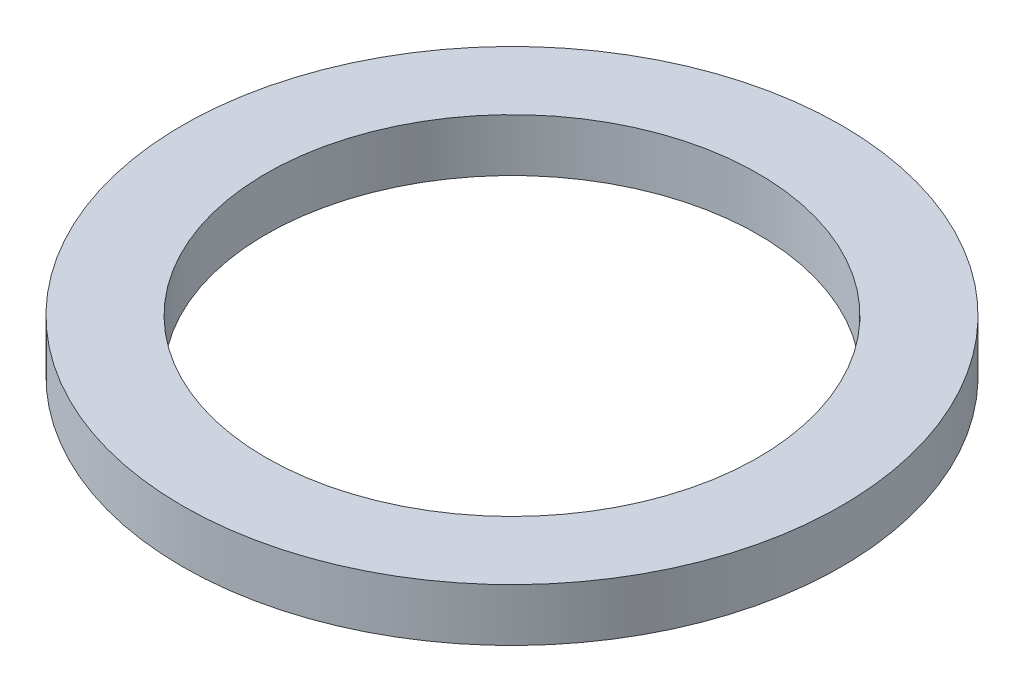
ISO-10303-21;
HEADER;
FILE_DESCRIPTION(('STEP AP214'),'2;1');
FILE_NAME('part.step','',(''),(''),'','','');
FILE_SCHEMA(('AUTOMOTIVE_DESIGN { 1 0 10303 214 1 1 1 1 }'));
ENDSEC;
DATA;
#1=APPLICATION_CONTEXT('core data for automotive mechanical design processes');
#2=APPLICATION_PROTOCOL_DEFINITION('international standard','automotive_design',2000,#1);
#3=PRODUCT_CONTEXT('',#1,'mechanical');
#4=PRODUCT('Part','Part','',(#3));
#5=PRODUCT_RELATED_PRODUCT_CATEGORY('part','',(#4));
#6=PRODUCT_DEFINITION_FORMATION('','',#4);
#7=PRODUCT_DEFINITION_CONTEXT('part definition',#1,'design');
#8=PRODUCT_DEFINITION('design','',#6,#7);
#9=PRODUCT_DEFINITION_SHAPE('','',#8);
#10=(LENGTH_UNIT() NAMED_UNIT(*) SI_UNIT(.MILLI.,.METRE.));
#11=(NAMED_UNIT(*) PLANE_ANGLE_UNIT() SI_UNIT($,.RADIAN.));
#12=(NAMED_UNIT(*) SI_UNIT($,.STERADIAN.) SOLID_ANGLE_UNIT());
#13=UNCERTAINTY_MEASURE_WITH_UNIT(LENGTH_MEASURE(1.E-05),#10,'distance_accuracy_value','');
#14=(GEOMETRIC_REPRESENTATION_CONTEXT(3) GLOBAL_UNCERTAINTY_ASSIGNED_CONTEXT((#13)) GLOBAL_UNIT_ASSIGNED_CONTEXT((#10,
#11,#12)) REPRESENTATION_CONTEXT('',''));
#15=CARTESIAN_POINT('',(0.,0.,0.));
#16=DIRECTION('',(0.,0.,1.));
#17=DIRECTION('',(1.,0.,0.));
#18=AXIS2_PLACEMENT_3D('',#15,#16,#17);
#19=CARTESIAN_POINT('',(0.,3.048,0.));
#20=DIRECTION('',(0.,1.,0.));
#21=DIRECTION('',(0.,0.,1.));
#22=AXIS2_PLACEMENT_3D('',#19,#20,#21);
#23=CYLINDRICAL_SURFACE('',#22,14.224);
#24=CARTESIAN_POINT('',(0.,3.048,0.));
#25=DIRECTION('',(0.,1.,0.));
#26=DIRECTION('',(0.,0.,1.));
#27=AXIS2_PLACEMENT_3D('',#24,#25,#26);
#28=CIRCLE('',#27,14.224);
#29=CARTESIAN_POINT('',(0.,3.048,14.224));
#30=VERTEX_POINT('',#29);
#31=EDGE_CURVE('E52',#30,#30,#28,.T.);
#32=ORIENTED_EDGE('',*,*,#31,.T.);
#33=EDGE_LOOP('',(#32));
#34=FACE_BOUND('',#33,.T.);
#35=CARTESIAN_POINT('',(0.,0.,0.));
#36=DIRECTION('',(0.,1.,0.));
#37=DIRECTION('',(0.,0.,1.));
#38=AXIS2_PLACEMENT_3D('',#35,#36,#37);
#39=CIRCLE('',#38,14.224);
#40=CARTESIAN_POINT('',(0.,0.,14.224));
#41=VERTEX_POINT('',#40);
#42=EDGE_CURVE('E60',#41,#41,#39,.T.);
#43=ORIENTED_EDGE('',*,*,#42,.F.);
#44=EDGE_LOOP('',(#43));
#45=FACE_BOUND('',#44,.T.);
#46=ADVANCED_FACE('F43',(#34,#45),#23,.F.);
#47=CARTESIAN_POINT('',(0.,3.048,0.));
#48=DIRECTION('',(0.,1.,0.));
#49=DIRECTION('',(0.,0.,1.));
#50=AXIS2_PLACEMENT_3D('',#47,#48,#49);
#51=CYLINDRICAL_SURFACE('',#50,19.05);
#52=CARTESIAN_POINT('',(0.,3.048,0.));
#53=DIRECTION('',(0.,1.,0.));
#54=DIRECTION('',(0.,0.,1.));
#55=AXIS2_PLACEMENT_3D('',#52,#53,#54);
#56=CIRCLE('',#55,19.05);
#57=CARTESIAN_POINT('',(0.,3.048,19.05));
#58=VERTEX_POINT('',#57);
#59=EDGE_CURVE('E10',#58,#58,#56,.T.);
#60=ORIENTED_EDGE('',*,*,#59,.F.);
#61=EDGE_LOOP('',(#60));
#62=FACE_BOUND('',#61,.T.);
#63=CARTESIAN_POINT('',(0.,0.,0.));
#64=DIRECTION('',(0.,1.,0.));
#65=DIRECTION('',(0.,0.,1.));
#66=AXIS2_PLACEMENT_3D('',#63,#64,#65);
#67=CIRCLE('',#66,19.05);
#68=CARTESIAN_POINT('',(0.,0.,19.05));
#69=VERTEX_POINT('',#68);
#70=EDGE_CURVE('E47',#69,#69,#67,.T.);
#71=ORIENTED_EDGE('',*,*,#70,.T.);
#72=EDGE_LOOP('',(#71));
#73=FACE_BOUND('',#72,.T.);
#74=ADVANCED_FACE('F45',(#62,#73),#51,.T.);
#75=CARTESIAN_POINT('',(0.,3.048,0.));
#76=DIRECTION('',(0.,1.,0.));
#77=DIRECTION('',(0.,0.,1.));
#78=AXIS2_PLACEMENT_3D('',#75,#76,#77);
#79=PLANE('',#78);
#80=ORIENTED_EDGE('',*,*,#31,.F.);
#81=EDGE_LOOP('',(#80));
#82=FACE_BOUND('',#81,.T.);
#83=ORIENTED_EDGE('',*,*,#59,.T.);
#84=EDGE_LOOP('',(#83));
#85=FACE_BOUND('',#84,.T.);
#86=ADVANCED_FACE('F74',(#82,#85),#79,.T.);
#87=CARTESIAN_POINT('',(0.,0.,0.));
#88=DIRECTION('',(0.,1.,0.));
#89=DIRECTION('',(0.,0.,1.));
#90=AXIS2_PLACEMENT_3D('',#87,#88,#89);
#91=PLANE('',#90);
#92=ORIENTED_EDGE('',*,*,#42,.T.);
#93=EDGE_LOOP('',(#92));
#94=FACE_BOUND('',#93,.T.);
#95=ORIENTED_EDGE('',*,*,#70,.F.);
#96=EDGE_LOOP('',(#95));
#97=FACE_BOUND('',#96,.T.);
#98=ADVANCED_FACE('F72',(#94,#97),#91,.F.);
#99=CLOSED_SHELL('',(#46,#74,#86,#98));
#100=MANIFOLD_SOLID_BREP('B2',#99);
#101=ADVANCED_BREP_SHAPE_REPRESENTATION('',(#18,#100),#14);
#102=SHAPE_DEFINITION_REPRESENTATION(#9,#101);
ENDSEC;
END-ISO-10303-21;
